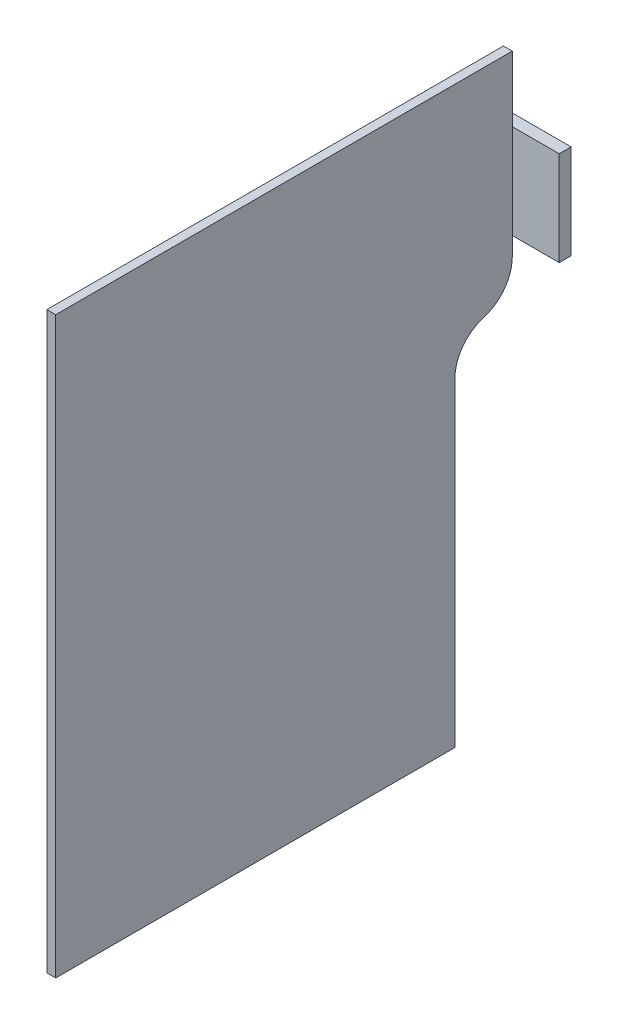
ISO-10303-21;
HEADER;
FILE_DESCRIPTION(('STEP AP214'),'2;1');
FILE_NAME('part.step','',(''),(''),'','','');
FILE_SCHEMA(('AUTOMOTIVE_DESIGN { 1 0 10303 214 1 1 1 1 }'));
ENDSEC;
DATA;
#1=APPLICATION_CONTEXT('core data for automotive mechanical design processes');
#2=APPLICATION_PROTOCOL_DEFINITION('international standard','automotive_design',2000,#1);
#3=PRODUCT_CONTEXT('',#1,'mechanical');
#4=PRODUCT('Part','Part','',(#3));
#5=PRODUCT_RELATED_PRODUCT_CATEGORY('part','',(#4));
#6=PRODUCT_DEFINITION_FORMATION('','',#4);
#7=PRODUCT_DEFINITION_CONTEXT('part definition',#1,'design');
#8=PRODUCT_DEFINITION('design','',#6,#7);
#9=PRODUCT_DEFINITION_SHAPE('','',#8);
#10=(LENGTH_UNIT() NAMED_UNIT(*) SI_UNIT(.MILLI.,.METRE.));
#11=(NAMED_UNIT(*) PLANE_ANGLE_UNIT() SI_UNIT($,.RADIAN.));
#12=(NAMED_UNIT(*) SI_UNIT($,.STERADIAN.) SOLID_ANGLE_UNIT());
#13=UNCERTAINTY_MEASURE_WITH_UNIT(LENGTH_MEASURE(1.E-05),#10,'distance_accuracy_value','');
#14=(GEOMETRIC_REPRESENTATION_CONTEXT(3) GLOBAL_UNCERTAINTY_ASSIGNED_CONTEXT((#13)) GLOBAL_UNIT_ASSIGNED_CONTEXT((#10,
#11,#12)) REPRESENTATION_CONTEXT('',''));
#15=CARTESIAN_POINT('',(0.,0.,0.));
#16=DIRECTION('',(0.,0.,1.));
#17=DIRECTION('',(1.,0.,0.));
#18=AXIS2_PLACEMENT_3D('',#15,#16,#17);
#19=CARTESIAN_POINT('',(0.,0.,3.));
#20=DIRECTION('',(0.,0.,1.));
#21=DIRECTION('',(1.,0.,0.));
#22=AXIS2_PLACEMENT_3D('',#19,#20,#21);
#23=PLANE('',#22);
#24=DIRECTION('',(0.,1.,0.));
#25=VECTOR('',#24,1.);
#26=CARTESIAN_POINT('',(-21.8224912739432,-115.951186980258,3.));
#27=LINE('',#26,#25);
#28=CARTESIAN_POINT('',(-21.8224912739432,-11.4857230032384,3.));
#29=VERTEX_POINT('',#28);
#30=CARTESIAN_POINT('',(-21.8224912739432,12.2713245870322,3.));
#31=VERTEX_POINT('',#30);
#32=EDGE_CURVE('E211',#29,#31,#27,.T.);
#33=ORIENTED_EDGE('',*,*,#32,.F.);
#34=DIRECTION('',(1.,0.,0.));
#35=VECTOR('',#34,1.);
#36=CARTESIAN_POINT('',(-33.7530603506486,-11.4857230032384,3.));
#37=LINE('',#36,#35);
#38=CARTESIAN_POINT('',(-9.99601276037809,-11.4857230032384,3.));
#39=VERTEX_POINT('',#38);
#40=EDGE_CURVE('E182',#29,#39,#37,.T.);
#41=ORIENTED_EDGE('',*,*,#40,.T.);
#42=DIRECTION('',(0.,1.,0.));
#43=VECTOR('',#42,1.);
#44=CARTESIAN_POINT('',(-9.99601276037809,12.2713245870322,3.));
#45=LINE('',#44,#43);
#46=CARTESIAN_POINT('',(-9.99601276037809,12.2713245870322,3.));
#47=VERTEX_POINT('',#46);
#48=EDGE_CURVE('E186',#39,#47,#45,.T.);
#49=ORIENTED_EDGE('',*,*,#48,.T.);
#50=DIRECTION('',(-1.,0.,0.));
#51=VECTOR('',#50,1.);
#52=CARTESIAN_POINT('',(-33.7530603506486,12.2713245870322,3.));
#53=LINE('',#52,#51);
#54=EDGE_CURVE('E189',#47,#31,#53,.T.);
#55=ORIENTED_EDGE('',*,*,#54,.T.);
#56=EDGE_LOOP('',(#33,#41,#49,#55));
#57=FACE_BOUND('',#56,.T.);
#58=ADVANCED_FACE('F43',(#57),#23,.T.);
#59=CARTESIAN_POINT('',(-33.7530603506486,12.2713245870322,3.));
#60=DIRECTION('',(1.,0.,0.));
#61=DIRECTION('',(0.,0.,-1.));
#62=AXIS2_PLACEMENT_3D('',#59,#60,#61);
#63=PLANE('',#62);
#64=DIRECTION('',(0.,-1.,0.));
#65=VECTOR('',#64,1.);
#66=CARTESIAN_POINT('',(-33.7530603506486,12.2713245870322,0.));
#67=LINE('',#66,#65);
#68=CARTESIAN_POINT('',(-33.7530603506486,12.2713245870322,0.));
#69=VERTEX_POINT('',#68);
#70=CARTESIAN_POINT('',(-33.7530603506486,-11.4857230032384,0.));
#71=VERTEX_POINT('',#70);
#72=EDGE_CURVE('E178',#69,#71,#67,.T.);
#73=ORIENTED_EDGE('',*,*,#72,.T.);
#74=DIRECTION('',(0.,0.,-1.));
#75=VECTOR('',#74,1.);
#76=CARTESIAN_POINT('',(-33.7530603506486,-11.4857230032384,3.));
#77=LINE('',#76,#75);
#78=CARTESIAN_POINT('',(-33.7530603506486,-11.4857230032384,3.));
#79=VERTEX_POINT('',#78);
#80=EDGE_CURVE('E208',#79,#71,#77,.T.);
#81=ORIENTED_EDGE('',*,*,#80,.F.);
#82=DIRECTION('',(0.,-1.,0.));
#83=VECTOR('',#82,1.);
#84=CARTESIAN_POINT('',(-33.7530603506486,12.2713245870322,3.));
#85=LINE('',#84,#83);
#86=CARTESIAN_POINT('',(-33.7530603506486,12.2713245870322,3.));
#87=VERTEX_POINT('',#86);
#88=EDGE_CURVE('E179',#87,#79,#85,.T.);
#89=ORIENTED_EDGE('',*,*,#88,.F.);
#90=DIRECTION('',(0.,0.,-1.));
#91=VECTOR('',#90,1.);
#92=CARTESIAN_POINT('',(-33.7530603506486,12.2713245870322,3.));
#93=LINE('',#92,#91);
#94=EDGE_CURVE('E192',#87,#69,#93,.T.);
#95=ORIENTED_EDGE('',*,*,#94,.T.);
#96=EDGE_LOOP('',(#73,#81,#89,#95));
#97=FACE_BOUND('',#96,.T.);
#98=ADVANCED_FACE('F290',(#97),#63,.F.);
#99=CARTESIAN_POINT('',(-33.7530603506486,-11.4857230032384,3.));
#100=DIRECTION('',(0.,1.,0.));
#101=DIRECTION('',(0.,0.,1.));
#102=AXIS2_PLACEMENT_3D('',#99,#100,#101);
#103=PLANE('',#102);
#104=DIRECTION('',(1.,0.,0.));
#105=VECTOR('',#104,1.);
#106=CARTESIAN_POINT('',(-33.7530603506486,-11.4857230032384,0.));
#107=LINE('',#106,#105);
#108=CARTESIAN_POINT('',(-9.99601276037809,-11.4857230032384,0.));
#109=VERTEX_POINT('',#108);
#110=EDGE_CURVE('E195',#71,#109,#107,.T.);
#111=ORIENTED_EDGE('',*,*,#110,.T.);
#112=DIRECTION('',(0.,0.,-1.));
#113=VECTOR('',#112,1.);
#114=CARTESIAN_POINT('',(-9.99601276037809,-11.4857230032384,3.));
#115=LINE('',#114,#113);
#116=EDGE_CURVE('E205',#39,#109,#115,.T.);
#117=ORIENTED_EDGE('',*,*,#116,.F.);
#118=ORIENTED_EDGE('',*,*,#40,.F.);
#119=CARTESIAN_POINT('',(-24.0522742087232,-11.4857230032385,3.));
#120=VERTEX_POINT('',#119);
#121=EDGE_CURVE('E185',#120,#29,#37,.T.);
#122=ORIENTED_EDGE('',*,*,#121,.F.);
#123=DIRECTION('',(0.,0.,-1.));
#124=VECTOR('',#123,1.);
#125=CARTESIAN_POINT('',(-24.0522742087232,-11.4857230032384,3.));
#126=LINE('',#125,#124);
#127=CARTESIAN_POINT('',(-24.0522742087232,-11.4857230032384,20.1442758349732));
#128=VERTEX_POINT('',#127);
#129=EDGE_CURVE('E218',#128,#120,#126,.T.);
#130=ORIENTED_EDGE('',*,*,#129,.F.);
#131=CARTESIAN_POINT('',(-44.0522742087232,-11.4857230032384,20.1442758349732));
#132=DIRECTION('',(0.,1.,0.));
#133=DIRECTION('',(0.,0.,1.));
#134=AXIS2_PLACEMENT_3D('',#131,#132,#133);
#135=CIRCLE('',#134,20.);
#136=EDGE_CURVE('E220',#128,#79,#135,.T.);
#137=ORIENTED_EDGE('',*,*,#136,.T.);
#138=ORIENTED_EDGE('',*,*,#80,.T.);
#139=EDGE_LOOP('',(#111,#117,#118,#122,#130,#137,#138));
#140=FACE_BOUND('',#139,.T.);
#141=ADVANCED_FACE('F297',(#140),#103,.F.);
#142=CARTESIAN_POINT('',(-9.99601276037809,12.2713245870322,3.));
#143=DIRECTION('',(-1.,0.,0.));
#144=DIRECTION('',(0.,0.,1.));
#145=AXIS2_PLACEMENT_3D('',#142,#143,#144);
#146=PLANE('',#145);
#147=DIRECTION('',(0.,1.,0.));
#148=VECTOR('',#147,1.);
#149=CARTESIAN_POINT('',(-9.99601276037809,12.2713245870322,0.));
#150=LINE('',#149,#148);
#151=CARTESIAN_POINT('',(-9.99601276037809,12.2713245870322,0.));
#152=VERTEX_POINT('',#151);
#153=EDGE_CURVE('E197',#109,#152,#150,.T.);
#154=ORIENTED_EDGE('',*,*,#153,.T.);
#155=DIRECTION('',(0.,0.,-1.));
#156=VECTOR('',#155,1.);
#157=CARTESIAN_POINT('',(-9.99601276037809,12.2713245870322,3.));
#158=LINE('',#157,#156);
#159=EDGE_CURVE('E202',#47,#152,#158,.T.);
#160=ORIENTED_EDGE('',*,*,#159,.F.);
#161=ORIENTED_EDGE('',*,*,#48,.F.);
#162=ORIENTED_EDGE('',*,*,#116,.T.);
#163=EDGE_LOOP('',(#154,#160,#161,#162));
#164=FACE_BOUND('',#163,.T.);
#165=ADVANCED_FACE('F282',(#164),#146,.F.);
#166=CARTESIAN_POINT('',(-33.7530603506486,12.2713245870322,3.));
#167=DIRECTION('',(0.,-1.,0.));
#168=DIRECTION('',(0.,0.,-1.));
#169=AXIS2_PLACEMENT_3D('',#166,#167,#168);
#170=PLANE('',#169);
#171=DIRECTION('',(-1.,0.,0.));
#172=VECTOR('',#171,1.);
#173=CARTESIAN_POINT('',(-33.7530603506486,12.2713245870322,0.));
#174=LINE('',#173,#172);
#175=EDGE_CURVE('E183',#152,#69,#174,.T.);
#176=ORIENTED_EDGE('',*,*,#175,.T.);
#177=ORIENTED_EDGE('',*,*,#94,.F.);
#178=CARTESIAN_POINT('',(-44.0522742087232,12.2713245870322,20.1442758349732));
#179=DIRECTION('',(0.,-1.,0.));
#180=DIRECTION('',(0.,0.,-1.));
#181=AXIS2_PLACEMENT_3D('',#178,#179,#180);
#182=CIRCLE('',#181,20.);
#183=CARTESIAN_POINT('',(-24.0522742087232,12.2713245870322,20.1442758349732));
#184=VERTEX_POINT('',#183);
#185=EDGE_CURVE('E163',#87,#184,#182,.T.);
#186=ORIENTED_EDGE('',*,*,#185,.T.);
#187=DIRECTION('',(0.,0.,1.));
#188=VECTOR('',#187,1.);
#189=CARTESIAN_POINT('',(-24.0522742087232,12.2713245870322,3.));
#190=LINE('',#189,#188);
#191=CARTESIAN_POINT('',(-24.0522742087232,12.2713245870322,3.));
#192=VERTEX_POINT('',#191);
#193=EDGE_CURVE('E212',#192,#184,#190,.T.);
#194=ORIENTED_EDGE('',*,*,#193,.F.);
#195=EDGE_CURVE('E188',#31,#192,#53,.T.);
#196=ORIENTED_EDGE('',*,*,#195,.F.);
#197=ORIENTED_EDGE('',*,*,#54,.F.);
#198=ORIENTED_EDGE('',*,*,#159,.T.);
#199=EDGE_LOOP('',(#176,#177,#186,#194,#196,#197,#198));
#200=FACE_BOUND('',#199,.T.);
#201=ADVANCED_FACE('F274',(#200),#170,.F.);
#202=CARTESIAN_POINT('',(0.,0.,0.));
#203=DIRECTION('',(0.,0.,1.));
#204=DIRECTION('',(1.,0.,0.));
#205=AXIS2_PLACEMENT_3D('',#202,#203,#204);
#206=PLANE('',#205);
#207=ORIENTED_EDGE('',*,*,#72,.F.);
#208=ORIENTED_EDGE('',*,*,#175,.F.);
#209=ORIENTED_EDGE('',*,*,#153,.F.);
#210=ORIENTED_EDGE('',*,*,#110,.F.);
#211=EDGE_LOOP('',(#207,#208,#209,#210));
#212=FACE_BOUND('',#211,.T.);
#213=ADVANCED_FACE('F287',(#212),#206,.F.);
#214=CARTESIAN_POINT('',(0.,0.,3.));
#215=DIRECTION('',(0.,0.,1.));
#216=DIRECTION('',(1.,0.,0.));
#217=AXIS2_PLACEMENT_3D('',#214,#215,#216);
#218=PLANE('',#217);
#219=CARTESIAN_POINT('',(-21.8224912739432,-16.1704678421844,3.));
#220=VERTEX_POINT('',#219);
#221=EDGE_CURVE('E237',#220,#29,#27,.T.);
#222=ORIENTED_EDGE('',*,*,#221,.F.);
#223=DIRECTION('',(-1.,0.,0.));
#224=VECTOR('',#223,1.);
#225=CARTESIAN_POINT('',(0.,-16.1704678421844,3.));
#226=LINE('',#225,#224);
#227=CARTESIAN_POINT('',(-24.0522742087232,-16.1704678421844,3.));
#228=VERTEX_POINT('',#227);
#229=EDGE_CURVE('E227',#220,#228,#226,.T.);
#230=ORIENTED_EDGE('',*,*,#229,.T.);
#231=DIRECTION('',(0.,-1.,0.));
#232=VECTOR('',#231,1.);
#233=CARTESIAN_POINT('',(-24.0522742087232,-115.951186980258,3.));
#234=LINE('',#233,#232);
#235=EDGE_CURVE('E236',#120,#228,#234,.T.);
#236=ORIENTED_EDGE('',*,*,#235,.F.);
#237=ORIENTED_EDGE('',*,*,#121,.T.);
#238=EDGE_LOOP('',(#222,#230,#236,#237));
#239=FACE_BOUND('',#238,.T.);
#240=ADVANCED_FACE('F234',(#239),#218,.F.);
#241=CARTESIAN_POINT('',(-21.8224912739432,28.7501351312839,3.));
#242=VERTEX_POINT('',#241);
#243=EDGE_CURVE('E152',#31,#242,#27,.T.);
#244=ORIENTED_EDGE('',*,*,#243,.F.);
#245=ORIENTED_EDGE('',*,*,#195,.T.);
#246=CARTESIAN_POINT('',(-24.0522742087232,28.7501351312839,3.));
#247=VERTEX_POINT('',#246);
#248=EDGE_CURVE('E242',#247,#192,#234,.T.);
#249=ORIENTED_EDGE('',*,*,#248,.F.);
#250=DIRECTION('',(-1.,0.,0.));
#251=VECTOR('',#250,1.);
#252=CARTESIAN_POINT('',(-21.8224912739432,28.7501351312839,3.));
#253=LINE('',#252,#251);
#254=EDGE_CURVE('E243',#242,#247,#253,.T.);
#255=ORIENTED_EDGE('',*,*,#254,.F.);
#256=EDGE_LOOP('',(#244,#245,#249,#255));
#257=FACE_BOUND('',#256,.T.);
#258=ADVANCED_FACE('F271',(#257),#218,.F.);
#259=CARTESIAN_POINT('',(-21.8224912739432,-115.951186980258,118.));
#260=DIRECTION('',(-1.,0.,0.));
#261=DIRECTION('',(0.,0.,1.));
#262=AXIS2_PLACEMENT_3D('',#259,#260,#261);
#263=PLANE('',#262);
#264=CARTESIAN_POINT('',(-21.8224912739431,-35.3802767877952,7.43374090855152));
#265=DIRECTION('',(-1.,0.,0.));
#266=DIRECTION('',(0.,0.,1.));
#267=AXIS2_PLACEMENT_3D('',#264,#265,#266);
#268=CIRCLE('',#267,10.);
#269=CARTESIAN_POINT('',(-21.8224912739432,-35.3802767877952,17.4337409085515));
#270=VERTEX_POINT('',#269);
#271=CARTESIAN_POINT('',(-21.8224912739431,-25.7753723149898,10.2168704542758));
#272=VERTEX_POINT('',#271);
#273=EDGE_CURVE('E224',#270,#272,#268,.T.);
#274=ORIENTED_EDGE('',*,*,#273,.T.);
#275=CARTESIAN_POINT('',(-21.8224912739431,-16.1704678421844,13.));
#276=DIRECTION('',(-1.,0.,0.));
#277=DIRECTION('',(0.,0.,1.));
#278=AXIS2_PLACEMENT_3D('',#275,#276,#277);
#279=CIRCLE('',#278,10.);
#280=EDGE_CURVE('E11',#272,#220,#279,.F.);
#281=ORIENTED_EDGE('',*,*,#280,.T.);
#282=ORIENTED_EDGE('',*,*,#221,.T.);
#283=ORIENTED_EDGE('',*,*,#32,.T.);
#284=ORIENTED_EDGE('',*,*,#243,.T.);
#285=DIRECTION('',(0.,0.,-1.));
#286=VECTOR('',#285,1.);
#287=CARTESIAN_POINT('',(-21.8224912739432,28.7501351312839,118.));
#288=LINE('',#287,#286);
#289=CARTESIAN_POINT('',(-21.8224912739432,28.7501351312839,118.));
#290=VERTEX_POINT('',#289);
#291=EDGE_CURVE('E171',#290,#242,#288,.T.);
#292=ORIENTED_EDGE('',*,*,#291,.F.);
#293=DIRECTION('',(0.,1.,0.));
#294=VECTOR('',#293,1.);
#295=CARTESIAN_POINT('',(-21.8224912739432,-115.951186980258,118.));
#296=LINE('',#295,#294);
#297=CARTESIAN_POINT('',(-21.8224912739432,-115.951186980258,118.));
#298=VERTEX_POINT('',#297);
#299=EDGE_CURVE('E245',#298,#290,#296,.T.);
#300=ORIENTED_EDGE('',*,*,#299,.F.);
#301=DIRECTION('',(0.,0.,-1.));
#302=VECTOR('',#301,1.);
#303=CARTESIAN_POINT('',(-21.8224912739432,-115.951186980258,118.));
#304=LINE('',#303,#302);
#305=CARTESIAN_POINT('',(-21.8224912739432,-115.951186980258,17.4337409085515));
#306=VERTEX_POINT('',#305);
#307=EDGE_CURVE('E168',#298,#306,#304,.T.);
#308=ORIENTED_EDGE('',*,*,#307,.T.);
#309=DIRECTION('',(0.,-1.,0.));
#310=VECTOR('',#309,1.);
#311=CARTESIAN_POINT('',(-21.8224912739432,-116.86770547872,17.4337409085515));
#312=LINE('',#311,#310);
#313=EDGE_CURVE('E153',#270,#306,#312,.T.);
#314=ORIENTED_EDGE('',*,*,#313,.F.);
#315=EDGE_LOOP('',(#274,#281,#282,#283,#284,#292,#300,#308,#314));
#316=FACE_BOUND('',#315,.T.);
#317=ADVANCED_FACE('F262',(#316),#263,.F.);
#318=CARTESIAN_POINT('',(-21.8224912739432,28.7501351312839,118.));
#319=DIRECTION('',(0.,-1.,0.));
#320=DIRECTION('',(0.,0.,-1.));
#321=AXIS2_PLACEMENT_3D('',#318,#319,#320);
#322=PLANE('',#321);
#323=ORIENTED_EDGE('',*,*,#254,.T.);
#324=DIRECTION('',(0.,0.,-1.));
#325=VECTOR('',#324,1.);
#326=CARTESIAN_POINT('',(-24.0522742087232,28.7501351312839,118.));
#327=LINE('',#326,#325);
#328=CARTESIAN_POINT('',(-24.0522742087232,28.7501351312839,118.));
#329=VERTEX_POINT('',#328);
#330=EDGE_CURVE('E167',#329,#247,#327,.T.);
#331=ORIENTED_EDGE('',*,*,#330,.F.);
#332=DIRECTION('',(-1.,0.,0.));
#333=VECTOR('',#332,1.);
#334=CARTESIAN_POINT('',(-21.8224912739432,28.7501351312839,118.));
#335=LINE('',#334,#333);
#336=EDGE_CURVE('E252',#290,#329,#335,.T.);
#337=ORIENTED_EDGE('',*,*,#336,.F.);
#338=ORIENTED_EDGE('',*,*,#291,.T.);
#339=EDGE_LOOP('',(#323,#331,#337,#338));
#340=FACE_BOUND('',#339,.T.);
#341=ADVANCED_FACE('F267',(#340),#322,.F.);
#342=CARTESIAN_POINT('',(-24.0522742087232,-115.951186980258,118.));
#343=DIRECTION('',(1.,0.,0.));
#344=DIRECTION('',(0.,0.,-1.));
#345=AXIS2_PLACEMENT_3D('',#342,#343,#344);
#346=PLANE('',#345);
#347=ORIENTED_EDGE('',*,*,#235,.T.);
#348=CARTESIAN_POINT('',(-24.0522742087232,-16.1704678421844,13.));
#349=DIRECTION('',(1.,0.,0.));
#350=DIRECTION('',(0.,0.,-1.));
#351=AXIS2_PLACEMENT_3D('',#348,#349,#350);
#352=CIRCLE('',#351,10.);
#353=CARTESIAN_POINT('',(-24.0522742087232,-25.7753723149898,10.2168704542758));
#354=VERTEX_POINT('',#353);
#355=EDGE_CURVE('E65',#228,#354,#352,.F.);
#356=ORIENTED_EDGE('',*,*,#355,.T.);
#357=CARTESIAN_POINT('',(-24.0522742087232,-35.3802767877952,7.43374090855152));
#358=DIRECTION('',(1.,0.,0.));
#359=DIRECTION('',(0.,0.,-1.));
#360=AXIS2_PLACEMENT_3D('',#357,#358,#359);
#361=CIRCLE('',#360,10.);
#362=CARTESIAN_POINT('',(-24.0522742087232,-35.3802767877952,17.4337409085515));
#363=VERTEX_POINT('',#362);
#364=EDGE_CURVE('E148',#354,#363,#361,.T.);
#365=ORIENTED_EDGE('',*,*,#364,.T.);
#366=DIRECTION('',(0.,-1.,0.));
#367=VECTOR('',#366,1.);
#368=CARTESIAN_POINT('',(-24.0522742087232,-115.951186980258,17.4337409085515));
#369=LINE('',#368,#367);
#370=CARTESIAN_POINT('',(-24.0522742087232,-115.951186980258,17.4337409085515));
#371=VERTEX_POINT('',#370);
#372=EDGE_CURVE('E141',#363,#371,#369,.T.);
#373=ORIENTED_EDGE('',*,*,#372,.T.);
#374=DIRECTION('',(0.,0.,-1.));
#375=VECTOR('',#374,1.);
#376=CARTESIAN_POINT('',(-24.0522742087232,-115.951186980258,118.));
#377=LINE('',#376,#375);
#378=CARTESIAN_POINT('',(-24.0522742087232,-115.951186980258,118.));
#379=VERTEX_POINT('',#378);
#380=EDGE_CURVE('E146',#379,#371,#377,.T.);
#381=ORIENTED_EDGE('',*,*,#380,.F.);
#382=DIRECTION('',(0.,-1.,0.));
#383=VECTOR('',#382,1.);
#384=CARTESIAN_POINT('',(-24.0522742087232,-115.951186980258,118.));
#385=LINE('',#384,#383);
#386=EDGE_CURVE('E250',#329,#379,#385,.T.);
#387=ORIENTED_EDGE('',*,*,#386,.F.);
#388=ORIENTED_EDGE('',*,*,#330,.T.);
#389=ORIENTED_EDGE('',*,*,#248,.T.);
#390=ORIENTED_EDGE('',*,*,#193,.T.);
#391=DIRECTION('',(0.,1.,0.));
#392=VECTOR('',#391,1.);
#393=CARTESIAN_POINT('',(-24.0522742087232,-115.951186980258,20.1442758349732));
#394=LINE('',#393,#392);
#395=EDGE_CURVE('E215',#184,#128,#394,.F.);
#396=ORIENTED_EDGE('',*,*,#395,.T.);
#397=ORIENTED_EDGE('',*,*,#129,.T.);
#398=EDGE_LOOP('',(#347,#356,#365,#373,#381,#387,#388,#389,#390,#396,#397));
#399=FACE_BOUND('',#398,.T.);
#400=ADVANCED_FACE('F143',(#399),#346,.F.);
#401=CARTESIAN_POINT('',(-21.8224912739432,-115.951186980258,118.));
#402=DIRECTION('',(0.,1.,0.));
#403=DIRECTION('',(0.,0.,1.));
#404=AXIS2_PLACEMENT_3D('',#401,#402,#403);
#405=PLANE('',#404);
#406=ORIENTED_EDGE('',*,*,#380,.T.);
#407=DIRECTION('',(1.,0.,0.));
#408=VECTOR('',#407,1.);
#409=CARTESIAN_POINT('',(-21.8224912739432,-115.951186980258,17.4337409085515));
#410=LINE('',#409,#408);
#411=EDGE_CURVE('E156',#371,#306,#410,.T.);
#412=ORIENTED_EDGE('',*,*,#411,.T.);
#413=ORIENTED_EDGE('',*,*,#307,.F.);
#414=DIRECTION('',(1.,0.,0.));
#415=VECTOR('',#414,1.);
#416=CARTESIAN_POINT('',(-21.8224912739432,-115.951186980258,118.));
#417=LINE('',#416,#415);
#418=EDGE_CURVE('E166',#379,#298,#417,.T.);
#419=ORIENTED_EDGE('',*,*,#418,.F.);
#420=EDGE_LOOP('',(#406,#412,#413,#419));
#421=FACE_BOUND('',#420,.T.);
#422=ADVANCED_FACE('F165',(#421),#405,.F.);
#423=CARTESIAN_POINT('',(0.,0.,118.));
#424=DIRECTION('',(0.,0.,1.));
#425=DIRECTION('',(1.,0.,0.));
#426=AXIS2_PLACEMENT_3D('',#423,#424,#425);
#427=PLANE('',#426);
#428=ORIENTED_EDGE('',*,*,#299,.T.);
#429=ORIENTED_EDGE('',*,*,#336,.T.);
#430=ORIENTED_EDGE('',*,*,#386,.T.);
#431=ORIENTED_EDGE('',*,*,#418,.T.);
#432=EDGE_LOOP('',(#428,#429,#430,#431));
#433=FACE_BOUND('',#432,.T.);
#434=ADVANCED_FACE('F259',(#433),#427,.T.);
#435=CARTESIAN_POINT('',(-44.0522742087232,0.,20.1442758349732));
#436=DIRECTION('',(0.,1.,0.));
#437=DIRECTION('',(0.,0.,1.));
#438=AXIS2_PLACEMENT_3D('',#435,#436,#437);
#439=CYLINDRICAL_SURFACE('',#438,20.);
#440=ORIENTED_EDGE('',*,*,#185,.F.);
#441=ORIENTED_EDGE('',*,*,#88,.T.);
#442=ORIENTED_EDGE('',*,*,#136,.F.);
#443=ORIENTED_EDGE('',*,*,#395,.F.);
#444=EDGE_LOOP('',(#440,#441,#442,#443));
#445=FACE_BOUND('',#444,.T.);
#446=ADVANCED_FACE('F295',(#445),#439,.F.);
#447=CARTESIAN_POINT('',(-96.8224912739432,-116.86770547872,17.4337409085515));
#448=DIRECTION('',(0.,0.,1.));
#449=DIRECTION('',(1.,0.,0.));
#450=AXIS2_PLACEMENT_3D('',#447,#448,#449);
#451=PLANE('',#450);
#452=ORIENTED_EDGE('',*,*,#372,.F.);
#453=DIRECTION('',(1.,0.,0.));
#454=VECTOR('',#453,1.);
#455=CARTESIAN_POINT('',(-21.8224912739431,-35.3802767877952,17.4337409085515));
#456=LINE('',#455,#454);
#457=EDGE_CURVE('E162',#363,#270,#456,.T.);
#458=ORIENTED_EDGE('',*,*,#457,.T.);
#459=ORIENTED_EDGE('',*,*,#313,.T.);
#460=ORIENTED_EDGE('',*,*,#411,.F.);
#461=EDGE_LOOP('',(#452,#458,#459,#460));
#462=FACE_BOUND('',#461,.T.);
#463=ADVANCED_FACE('F157',(#462),#451,.F.);
#464=CARTESIAN_POINT('',(-96.8224912739432,-35.3802767877952,7.43374090855152));
#465=DIRECTION('',(-1.,0.,0.));
#466=DIRECTION('',(0.,0.,1.));
#467=AXIS2_PLACEMENT_3D('',#464,#465,#466);
#468=CYLINDRICAL_SURFACE('',#467,10.);
#469=ORIENTED_EDGE('',*,*,#364,.F.);
#470=DIRECTION('',(-1.,0.,0.));
#471=VECTOR('',#470,1.);
#472=CARTESIAN_POINT('',(-96.8224912739432,-25.7753723149898,10.2168704542758));
#473=LINE('',#472,#471);
#474=EDGE_CURVE('E51',#354,#272,#473,.F.);
#475=ORIENTED_EDGE('',*,*,#474,.T.);
#476=ORIENTED_EDGE('',*,*,#273,.F.);
#477=ORIENTED_EDGE('',*,*,#457,.F.);
#478=EDGE_LOOP('',(#469,#475,#476,#477));
#479=FACE_BOUND('',#478,.T.);
#480=ADVANCED_FACE('F344',(#479),#468,.F.);
#481=CARTESIAN_POINT('',(-96.8224912739432,-16.1704678421844,13.));
#482=DIRECTION('',(-1.,0.,0.));
#483=DIRECTION('',(0.,0.,1.));
#484=AXIS2_PLACEMENT_3D('',#481,#482,#483);
#485=CYLINDRICAL_SURFACE('',#484,10.);
#486=ORIENTED_EDGE('',*,*,#280,.F.);
#487=ORIENTED_EDGE('',*,*,#474,.F.);
#488=ORIENTED_EDGE('',*,*,#355,.F.);
#489=ORIENTED_EDGE('',*,*,#229,.F.);
#490=EDGE_LOOP('',(#486,#487,#488,#489));
#491=FACE_BOUND('',#490,.T.);
#492=ADVANCED_FACE('F45',(#491),#485,.T.);
#493=CLOSED_SHELL('',(#58,#98,#141,#165,#201,#213,#240,#258,#317,#341,#400,#422,#434,#446,#463,
#480,#492));
#494=MANIFOLD_SOLID_BREP('B2',#493);
#495=ADVANCED_BREP_SHAPE_REPRESENTATION('',(#18,#494),#14);
#496=SHAPE_DEFINITION_REPRESENTATION(#9,#495);
ENDSEC;
END-ISO-10303-21;
